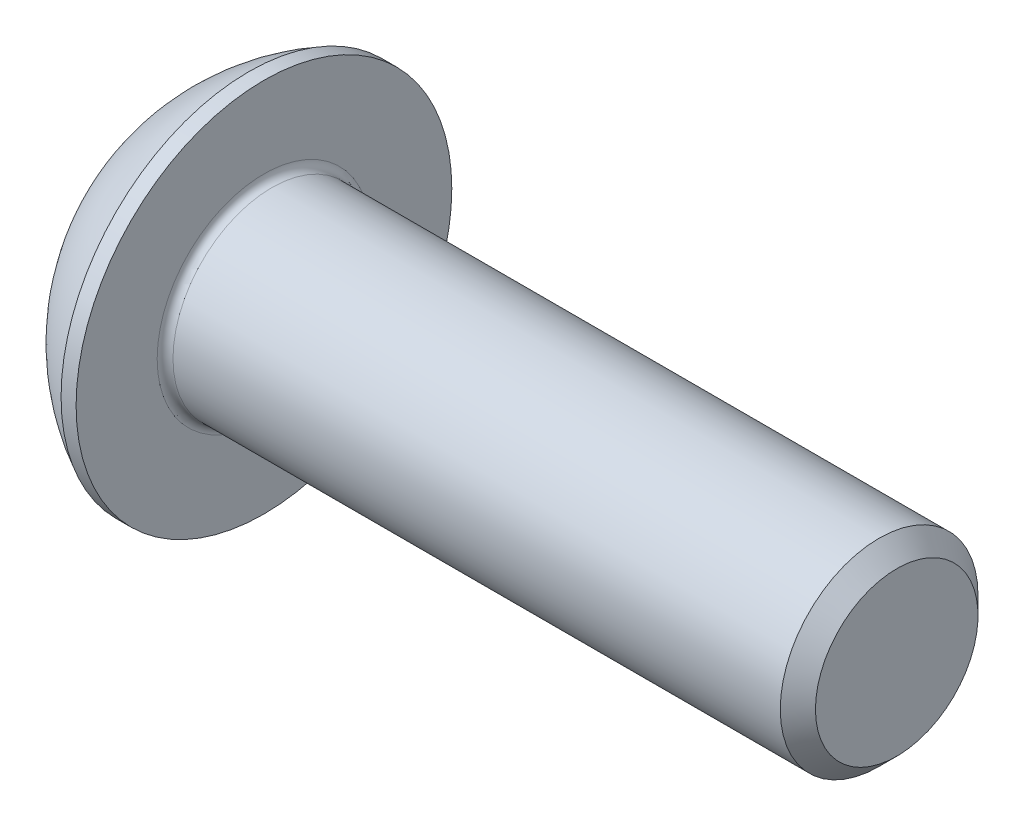
ISO-10303-21;
HEADER;
FILE_DESCRIPTION(('STEP AP214'),'2;1');
FILE_NAME('part.step','',(''),(''),'','','');
FILE_SCHEMA(('AUTOMOTIVE_DESIGN { 1 0 10303 214 1 1 1 1 }'));
ENDSEC;
DATA;
#1=APPLICATION_CONTEXT('core data for automotive mechanical design processes');
#2=APPLICATION_PROTOCOL_DEFINITION('international standard','automotive_design',2000,#1);
#3=PRODUCT_CONTEXT('',#1,'mechanical');
#4=PRODUCT('Part','Part','',(#3));
#5=PRODUCT_RELATED_PRODUCT_CATEGORY('part','',(#4));
#6=PRODUCT_DEFINITION_FORMATION('','',#4);
#7=PRODUCT_DEFINITION_CONTEXT('part definition',#1,'design');
#8=PRODUCT_DEFINITION('design','',#6,#7);
#9=PRODUCT_DEFINITION_SHAPE('','',#8);
#10=(LENGTH_UNIT() NAMED_UNIT(*) SI_UNIT(.MILLI.,.METRE.));
#11=(NAMED_UNIT(*) PLANE_ANGLE_UNIT() SI_UNIT($,.RADIAN.));
#12=(NAMED_UNIT(*) SI_UNIT($,.STERADIAN.) SOLID_ANGLE_UNIT());
#13=UNCERTAINTY_MEASURE_WITH_UNIT(LENGTH_MEASURE(1.E-05),#10,'distance_accuracy_value','');
#14=(GEOMETRIC_REPRESENTATION_CONTEXT(3) GLOBAL_UNCERTAINTY_ASSIGNED_CONTEXT((#13)) GLOBAL_UNIT_ASSIGNED_CONTEXT((#10,
#11,#12)) REPRESENTATION_CONTEXT('',''));
#15=CARTESIAN_POINT('',(0.,0.,0.));
#16=DIRECTION('',(0.,0.,1.));
#17=DIRECTION('',(1.,0.,0.));
#18=AXIS2_PLACEMENT_3D('',#15,#16,#17);
#19=CARTESIAN_POINT('',(0.,0.,0.));
#20=DIRECTION('',(-1.,0.,0.));
#21=DIRECTION('',(0.,0.,1.));
#22=AXIS2_PLACEMENT_3D('',#19,#20,#21);
#23=PLANE('',#22);
#24=CARTESIAN_POINT('',(0.,0.,0.));
#25=DIRECTION('',(-1.,0.,0.));
#26=DIRECTION('',(0.,0.,1.));
#27=AXIS2_PLACEMENT_3D('',#24,#25,#26);
#28=CIRCLE('',#27,2.375);
#29=CARTESIAN_POINT('',(0.,2.375,0.));
#30=VERTEX_POINT('',#29);
#31=EDGE_CURVE('E157',#30,#30,#28,.T.);
#32=ORIENTED_EDGE('',*,*,#31,.T.);
#33=EDGE_LOOP('',(#32));
#34=FACE_BOUND('',#33,.T.);
#35=DIRECTION('',(0.,-1.,0.));
#36=VECTOR('',#35,1.);
#37=CARTESIAN_POINT('',(0.,-0.866025403784438,1.5));
#38=LINE('',#37,#36);
#39=CARTESIAN_POINT('',(0.,0.866025403784439,1.5));
#40=VERTEX_POINT('',#39);
#41=CARTESIAN_POINT('',(0.,-0.866025403784438,1.5));
#42=VERTEX_POINT('',#41);
#43=EDGE_CURVE('E52',#40,#42,#38,.T.);
#44=ORIENTED_EDGE('',*,*,#43,.T.);
#45=DIRECTION('',(0.,-0.500000000000001,-0.866025403784438));
#46=VECTOR('',#45,1.);
#47=CARTESIAN_POINT('',(0.,-1.73205080756888,0.));
#48=LINE('',#47,#46);
#49=CARTESIAN_POINT('',(0.,-1.73205080756888,0.));
#50=VERTEX_POINT('',#49);
#51=EDGE_CURVE('E277',#42,#50,#48,.T.);
#52=ORIENTED_EDGE('',*,*,#51,.T.);
#53=DIRECTION('',(0.,0.500000000000001,-0.866025403784438));
#54=VECTOR('',#53,1.);
#55=CARTESIAN_POINT('',(0.,-0.866025403784438,-1.5));
#56=LINE('',#55,#54);
#57=CARTESIAN_POINT('',(0.,-0.866025403784438,-1.5));
#58=VERTEX_POINT('',#57);
#59=EDGE_CURVE('E132',#50,#58,#56,.T.);
#60=ORIENTED_EDGE('',*,*,#59,.T.);
#61=DIRECTION('',(0.,1.,0.));
#62=VECTOR('',#61,1.);
#63=CARTESIAN_POINT('',(0.,0.866025403784439,-1.5));
#64=LINE('',#63,#62);
#65=CARTESIAN_POINT('',(0.,0.866025403784439,-1.5));
#66=VERTEX_POINT('',#65);
#67=EDGE_CURVE('E280',#58,#66,#64,.T.);
#68=ORIENTED_EDGE('',*,*,#67,.T.);
#69=DIRECTION('',(0.,0.5,0.866025403784439));
#70=VECTOR('',#69,1.);
#71=CARTESIAN_POINT('',(0.,1.73205080756888,0.));
#72=LINE('',#71,#70);
#73=CARTESIAN_POINT('',(0.,1.73205080756888,0.));
#74=VERTEX_POINT('',#73);
#75=EDGE_CURVE('E282',#66,#74,#72,.T.);
#76=ORIENTED_EDGE('',*,*,#75,.T.);
#77=DIRECTION('',(0.,-0.5,0.866025403784439));
#78=VECTOR('',#77,1.);
#79=CARTESIAN_POINT('',(0.,0.866025403784439,1.5));
#80=LINE('',#79,#78);
#81=EDGE_CURVE('E284',#74,#40,#80,.T.);
#82=ORIENTED_EDGE('',*,*,#81,.T.);
#83=EDGE_LOOP('',(#44,#52,#60,#68,#76,#82));
#84=FACE_BOUND('',#83,.T.);
#85=ADVANCED_FACE('F37',(#34,#84),#23,.T.);
#86=CARTESIAN_POINT('',(4.75501582278481,0.,0.));
#87=DIRECTION('',(-1.,0.,0.));
#88=DIRECTION('',(0.,1.,0.));
#89=AXIS2_PLACEMENT_3D('',#86,#87,#88);
#90=SPHERICAL_SURFACE('',#89,5.3151482081814);
#91=CARTESIAN_POINT('',(2.37,0.,0.));
#92=DIRECTION('',(-1.,0.,0.));
#93=DIRECTION('',(0.,0.,1.));
#94=AXIS2_PLACEMENT_3D('',#91,#92,#93);
#95=CIRCLE('',#94,4.75);
#96=CARTESIAN_POINT('',(2.37,4.75,0.));
#97=VERTEX_POINT('',#96);
#98=EDGE_CURVE('E154',#97,#97,#95,.T.);
#99=CARTESIAN_POINT('',(2.37,4.75,0.));
#100=CARTESIAN_POINT('',(2.33822259048669,4.73404434732511,0.));
#101=CARTESIAN_POINT('',(2.30660534291523,4.71776971995817,0.));
#102=CARTESIAN_POINT('',(2.24370380094997,4.68458927158339,0.));
#103=CARTESIAN_POINT('',(2.21241950655618,4.66768345057555,0.));
#104=CARTESIAN_POINT('',(2.15019650024021,4.6332473706621,0.));
#105=CARTESIAN_POINT('',(2.11925778831804,4.6157171117565,0.));
#106=CARTESIAN_POINT('',(2.05773840110808,4.58003923142985,0.));
#107=CARTESIAN_POINT('',(2.02715772582028,4.56189161000879,0.));
#108=CARTESIAN_POINT('',(1.96636673145741,4.52498631044657,0.));
#109=CARTESIAN_POINT('',(1.93615641238234,4.50622863230542,0.));
#110=CARTESIAN_POINT('',(1.87611829826807,4.46811077571318,0.));
#111=CARTESIAN_POINT('',(1.84629050322887,4.4487505972621,0.));
#112=CARTESIAN_POINT('',(1.78702945162455,4.40943553782984,0.));
#113=CARTESIAN_POINT('',(1.75759619505941,4.38948065684866,0.));
#114=CARTESIAN_POINT('',(1.69913607574061,4.34898423002648,0.));
#115=CARTESIAN_POINT('',(1.67010921298694,4.32844268418549,0.));
#116=CARTESIAN_POINT('',(1.61247357298735,4.28678120152175,0.));
#117=CARTESIAN_POINT('',(1.58386479574144,4.265661264699,0.));
#118=CARTESIAN_POINT('',(1.52707685004032,4.22285150694424,0.));
#119=CARTESIAN_POINT('',(1.49889768158512,4.20116168601223,0.));
#120=CARTESIAN_POINT('',(1.44298030371049,4.15722089644741,0.));
#121=CARTESIAN_POINT('',(1.41524209429107,4.13496992781461,0.));
#122=CARTESIAN_POINT('',(1.36021780711889,4.08991580528235,0.));
#123=CARTESIAN_POINT('',(1.33293172936613,4.06711265138288,0.));
#124=CARTESIAN_POINT('',(1.278822696045,4.02096334316478,0.));
#125=CARTESIAN_POINT('',(1.25199974047662,3.99761718884614,0.));
#126=CARTESIAN_POINT('',(1.19882775550162,3.95039128335163,0.));
#127=CARTESIAN_POINT('',(1.172478726095,3.92651153217576,0.));
#128=CARTESIAN_POINT('',(1.1202652065289,3.87822805145535,0.));
#129=CARTESIAN_POINT('',(1.09440071636942,3.85382432191081,0.));
#130=CARTESIAN_POINT('',(1.04316669321618,3.8045027139941,0.));
#131=CARTESIAN_POINT('',(1.01779716022241,3.77958483562192,0.));
#132=CARTESIAN_POINT('',(0.9675632699561,3.72924496668416,0.));
#133=CARTESIAN_POINT('',(0.942698912683562,3.70382297611859,0.));
#134=CARTESIAN_POINT('',(0.893485388936279,3.65248512247887,0.));
#135=CARTESIAN_POINT('',(0.869136222461535,3.62656925940472,0.));
#136=CARTESIAN_POINT('',(0.820962887873489,3.57425409935885,0.));
#137=CARTESIAN_POINT('',(0.797138719760188,3.54785480238711,0.));
#138=CARTESIAN_POINT('',(0.750024977995378,3.49458340787865,0.));
#139=CARTESIAN_POINT('',(0.726735404343869,3.46771131034191,0.));
#140=CARTESIAN_POINT('',(0.68070023227454,3.41350513847464,0.));
#141=CARTESIAN_POINT('',(0.657954633856721,3.3861710641441,0.));
#142=CARTESIAN_POINT('',(0.613016573919582,3.33105194853939,0.));
#143=CARTESIAN_POINT('',(0.590824112400263,3.30326690726522,0.));
#144=CARTESIAN_POINT('',(0.547001265128254,3.24725704926748,0.));
#145=CARTESIAN_POINT('',(0.525370879375564,3.21903223254391,0.));
#146=CARTESIAN_POINT('',(0.482680896105488,3.16215419227902,0.));
#147=CARTESIAN_POINT('',(0.461621298588104,3.13350096873769,0.));
#148=CARTESIAN_POINT('',(0.420081374357153,3.07577765602273,0.));
#149=CARTESIAN_POINT('',(0.399601047643587,3.04670756684908,0.));
#150=CARTESIAN_POINT('',(0.359227914239947,2.98816223197683,0.));
#151=CARTESIAN_POINT('',(0.339335107549873,2.95868698627822,0.));
#152=CARTESIAN_POINT('',(0.300145026860787,2.89934321060632,0.));
#153=CARTESIAN_POINT('',(0.280847752861776,2.86947468063304,0.));
#154=CARTESIAN_POINT('',(0.24285650999714,2.80935636725696,0.));
#155=CARTESIAN_POINT('',(0.224162541131515,2.77910658385417,0.));
#156=CARTESIAN_POINT('',(0.187385439283607,2.71823794734018,0.));
#157=CARTESIAN_POINT('',(0.169302306301324,2.68761909422898,0.));
#158=CARTESIAN_POINT('',(0.133754156035988,2.626024653246,0.));
#159=CARTESIAN_POINT('',(0.116289138752934,2.59504906537422,0.));
#160=CARTESIAN_POINT('',(0.081984269005742,2.53275362391635,0.));
#161=CARTESIAN_POINT('',(0.0651444165416036,2.50143377033028,0.));
#162=CARTESIAN_POINT('',(0.0320966055444289,2.43846244094735,0.));
#163=CARTESIAN_POINT('',(0.0158886470113927,2.40681096515049,0.));
#164=CARTESIAN_POINT('',(0.,2.375,0.));
#165=B_SPLINE_CURVE_WITH_KNOTS('',3,(#99,#100,#101,#102,#103,#104,#105,#106,#107,#108,#109,#110,
#111,#112,#113,#114,#115,#116,#117,#118,#119,#120,#121,#122,#123,#124,#125,#126,#127,#128,#129,
#130,#131,#132,#133,#134,#135,#136,#137,#138,#139,#140,#141,#142,#143,#144,#145,#146,#147,#148,
#149,#150,#151,#152,#153,#154,#155,#156,#157,#158,#159,#160,#161,#162,#163,#164),.UNSPECIFIED.,
.F.,.F.,(4,2,2,2,2,2,2,2,2,2,2,2,2,2,2,2,2,2,2,2,2,2,2,2,2,2,2,2,2,2,2,2,4),(0.,
0.106672849678272,0.213345699356545,0.320018549034817,0.42669139871309,0.533364248391363,
0.640037098069635,0.746709947747908,0.85338279742618,0.960055647104452,1.06672849678273,
1.173401346461,1.28007419613927,1.38674704581754,1.49341989549582,1.60009274517409,
1.70676559485236,1.81343844453063,1.9201112942089,2.02678414388718,2.13345699356545,
2.24012984324372,2.346802692922,2.45347554260027,2.56014839227854,2.66682124195681,
2.77349409163509,2.88016694131336,2.98683979099163,3.0935126406699,3.20018549034817,
3.30685834002645,3.41353118970472),.UNSPECIFIED.);
#166=EDGE_CURVE('BSEAM178',#97,#30,#165,.T.);
#167=ORIENTED_EDGE('',*,*,#98,.T.);
#168=ORIENTED_EDGE('',*,*,#31,.F.);
#169=ORIENTED_EDGE('',*,*,#166,.T.);
#170=ORIENTED_EDGE('',*,*,#166,.F.);
#171=EDGE_LOOP('',(#167,#169,#168,#170));
#172=FACE_BOUND('',#171,.T.);
#173=ADVANCED_FACE('F178',(#172),#90,.T.);
#174=CARTESIAN_POINT('',(0.,0.,0.));
#175=DIRECTION('',(-1.,0.,0.));
#176=DIRECTION('',(0.,0.,1.));
#177=AXIS2_PLACEMENT_3D('',#174,#175,#176);
#178=CYLINDRICAL_SURFACE('',#177,4.75);
#179=ORIENTED_EDGE('',*,*,#98,.F.);
#180=EDGE_LOOP('',(#179));
#181=FACE_BOUND('',#180,.T.);
#182=CARTESIAN_POINT('',(2.75,0.,0.));
#183=DIRECTION('',(-1.,0.,0.));
#184=DIRECTION('',(0.,0.,1.));
#185=AXIS2_PLACEMENT_3D('',#182,#183,#184);
#186=CIRCLE('',#185,4.75);
#187=CARTESIAN_POINT('',(2.75,0.,4.75));
#188=VERTEX_POINT('',#187);
#189=EDGE_CURVE('E151',#188,#188,#186,.T.);
#190=ORIENTED_EDGE('',*,*,#189,.T.);
#191=EDGE_LOOP('',(#190));
#192=FACE_BOUND('',#191,.T.);
#193=ADVANCED_FACE('F183',(#181,#192),#178,.T.);
#194=CARTESIAN_POINT('',(2.75,2.5,0.));
#195=DIRECTION('',(-1.,0.,0.));
#196=DIRECTION('',(0.,0.,1.));
#197=AXIS2_PLACEMENT_3D('',#194,#195,#196);
#198=PLANE('',#197);
#199=CARTESIAN_POINT('',(2.75,0.,0.));
#200=DIRECTION('',(-1.,0.,0.));
#201=DIRECTION('',(0.,0.,1.));
#202=AXIS2_PLACEMENT_3D('',#199,#200,#201);
#203=CIRCLE('',#202,2.7);
#204=CARTESIAN_POINT('',(2.75,0.,2.7));
#205=VERTEX_POINT('',#204);
#206=EDGE_CURVE('E45',#205,#205,#203,.T.);
#207=ORIENTED_EDGE('',*,*,#206,.T.);
#208=EDGE_LOOP('',(#207));
#209=FACE_BOUND('',#208,.T.);
#210=ORIENTED_EDGE('',*,*,#189,.F.);
#211=EDGE_LOOP('',(#210));
#212=FACE_BOUND('',#211,.T.);
#213=ADVANCED_FACE('F162',(#209,#212),#198,.F.);
#214=CARTESIAN_POINT('',(0.,0.,0.));
#215=DIRECTION('',(-1.,0.,0.));
#216=DIRECTION('',(0.,0.,1.));
#217=AXIS2_PLACEMENT_3D('',#214,#215,#216);
#218=CYLINDRICAL_SURFACE('',#217,2.5);
#219=CARTESIAN_POINT('',(2.95,0.,0.));
#220=DIRECTION('',(-1.,0.,0.));
#221=DIRECTION('',(0.,0.,1.));
#222=AXIS2_PLACEMENT_3D('',#219,#220,#221);
#223=CIRCLE('',#222,2.5);
#224=CARTESIAN_POINT('',(2.95,0.,2.5));
#225=VERTEX_POINT('',#224);
#226=EDGE_CURVE('E11',#225,#225,#223,.F.);
#227=ORIENTED_EDGE('',*,*,#226,.T.);
#228=EDGE_LOOP('',(#227));
#229=FACE_BOUND('',#228,.T.);
#230=CARTESIAN_POINT('',(18.305,0.,0.));
#231=DIRECTION('',(-1.,0.,0.));
#232=DIRECTION('',(0.,0.,1.));
#233=AXIS2_PLACEMENT_3D('',#230,#231,#232);
#234=CIRCLE('',#233,2.5);
#235=CARTESIAN_POINT('',(18.305,0.,2.5));
#236=VERTEX_POINT('',#235);
#237=EDGE_CURVE('E148',#236,#236,#234,.T.);
#238=ORIENTED_EDGE('',*,*,#237,.T.);
#239=EDGE_LOOP('',(#238));
#240=FACE_BOUND('',#239,.T.);
#241=ADVANCED_FACE('F192',(#229,#240),#218,.T.);
#242=CARTESIAN_POINT('',(18.75,0.,0.));
#243=DIRECTION('',(-1.,0.,0.));
#244=DIRECTION('',(0.,0.,1.));
#245=AXIS2_PLACEMENT_3D('',#242,#243,#244);
#246=CONICAL_SURFACE('',#245,2.055,0.785398163397441);
#247=ORIENTED_EDGE('',*,*,#237,.F.);
#248=EDGE_LOOP('',(#247));
#249=FACE_BOUND('',#248,.T.);
#250=CARTESIAN_POINT('',(18.75,0.,0.));
#251=DIRECTION('',(-1.,0.,0.));
#252=DIRECTION('',(0.,0.,1.));
#253=AXIS2_PLACEMENT_3D('',#250,#251,#252);
#254=CIRCLE('',#253,2.055);
#255=CARTESIAN_POINT('',(18.75,0.,2.055));
#256=VERTEX_POINT('',#255);
#257=EDGE_CURVE('E144',#256,#256,#254,.T.);
#258=ORIENTED_EDGE('',*,*,#257,.T.);
#259=EDGE_LOOP('',(#258));
#260=FACE_BOUND('',#259,.T.);
#261=ADVANCED_FACE('F173',(#249,#260),#246,.T.);
#262=CARTESIAN_POINT('',(18.75,0.,0.));
#263=DIRECTION('',(-1.,0.,0.));
#264=DIRECTION('',(0.,0.,1.));
#265=AXIS2_PLACEMENT_3D('',#262,#263,#264);
#266=PLANE('',#265);
#267=ORIENTED_EDGE('',*,*,#257,.F.);
#268=EDGE_LOOP('',(#267));
#269=FACE_BOUND('',#268,.T.);
#270=ADVANCED_FACE('F166',(#269),#266,.F.);
#271=CARTESIAN_POINT('',(2.95,0.,0.));
#272=DIRECTION('',(-1.,0.,0.));
#273=DIRECTION('',(0.,0.,1.));
#274=AXIS2_PLACEMENT_3D('',#271,#272,#273);
#275=TOROIDAL_SURFACE('',#274,2.7,0.2);
#276=ORIENTED_EDGE('',*,*,#226,.F.);
#277=EDGE_LOOP('',(#276));
#278=FACE_BOUND('',#277,.T.);
#279=ORIENTED_EDGE('',*,*,#206,.F.);
#280=EDGE_LOOP('',(#279));
#281=FACE_BOUND('',#280,.T.);
#282=ADVANCED_FACE('F39',(#278,#281),#275,.F.);
#283=CARTESIAN_POINT('',(1.56,-1.73205080756888,0.));
#284=DIRECTION('',(0.,0.866025403784438,-0.500000000000001));
#285=DIRECTION('',(0.,0.500000000000001,0.866025403784438));
#286=AXIS2_PLACEMENT_3D('',#283,#284,#285);
#287=PLANE('',#286);
#288=DIRECTION('',(0.,-0.500000000000001,-0.866025403784438));
#289=VECTOR('',#288,1.);
#290=CARTESIAN_POINT('',(1.56,-1.73205080756888,0.));
#291=LINE('',#290,#289);
#292=CARTESIAN_POINT('',(1.56,-0.866025403784438,1.5));
#293=VERTEX_POINT('',#292);
#294=CARTESIAN_POINT('',(1.56,-1.29903810567666,0.750000000000002));
#295=VERTEX_POINT('',#294);
#296=EDGE_CURVE('E118',#293,#295,#291,.T.);
#297=ORIENTED_EDGE('',*,*,#296,.T.);
#298=CARTESIAN_POINT('',(1.56,-1.73205080756888,0.));
#299=VERTEX_POINT('',#298);
#300=EDGE_CURVE('E113',#295,#299,#291,.T.);
#301=ORIENTED_EDGE('',*,*,#300,.T.);
#302=DIRECTION('',(-1.,0.,0.));
#303=VECTOR('',#302,1.);
#304=CARTESIAN_POINT('',(1.56,-1.73205080756888,0.));
#305=LINE('',#304,#303);
#306=EDGE_CURVE('E115',#299,#50,#305,.T.);
#307=ORIENTED_EDGE('',*,*,#306,.T.);
#308=ORIENTED_EDGE('',*,*,#51,.F.);
#309=DIRECTION('',(-1.,0.,0.));
#310=VECTOR('',#309,1.);
#311=CARTESIAN_POINT('',(1.56,-0.866025403784438,1.5));
#312=LINE('',#311,#310);
#313=EDGE_CURVE('E273',#293,#42,#312,.T.);
#314=ORIENTED_EDGE('',*,*,#313,.F.);
#315=EDGE_LOOP('',(#297,#301,#307,#308,#314));
#316=FACE_BOUND('',#315,.T.);
#317=ADVANCED_FACE('F114',(#316),#287,.T.);
#318=CARTESIAN_POINT('',(1.56,-0.866025403784438,-1.5));
#319=DIRECTION('',(0.,0.866025403784438,0.500000000000001));
#320=DIRECTION('',(0.,-0.500000000000001,0.866025403784438));
#321=AXIS2_PLACEMENT_3D('',#318,#319,#320);
#322=PLANE('',#321);
#323=DIRECTION('',(0.,0.500000000000001,-0.866025403784438));
#324=VECTOR('',#323,1.);
#325=CARTESIAN_POINT('',(1.56,-0.866025403784438,-1.5));
#326=LINE('',#325,#324);
#327=CARTESIAN_POINT('',(1.56,-1.29903810567666,-0.750000000000001));
#328=VERTEX_POINT('',#327);
#329=EDGE_CURVE('E60',#299,#328,#326,.T.);
#330=ORIENTED_EDGE('',*,*,#329,.T.);
#331=CARTESIAN_POINT('',(1.56,-0.866025403784438,-1.5));
#332=VERTEX_POINT('',#331);
#333=EDGE_CURVE('E127',#328,#332,#326,.T.);
#334=ORIENTED_EDGE('',*,*,#333,.T.);
#335=DIRECTION('',(-1.,0.,0.));
#336=VECTOR('',#335,1.);
#337=CARTESIAN_POINT('',(1.56,-0.866025403784438,-1.5));
#338=LINE('',#337,#336);
#339=EDGE_CURVE('E134',#332,#58,#338,.T.);
#340=ORIENTED_EDGE('',*,*,#339,.T.);
#341=ORIENTED_EDGE('',*,*,#59,.F.);
#342=ORIENTED_EDGE('',*,*,#306,.F.);
#343=EDGE_LOOP('',(#330,#334,#340,#341,#342));
#344=FACE_BOUND('',#343,.T.);
#345=ADVANCED_FACE('F130',(#344),#322,.T.);
#346=CARTESIAN_POINT('',(1.56,0.866025403784439,-1.5));
#347=DIRECTION('',(0.,0.,1.));
#348=DIRECTION('',(1.,0.,0.));
#349=AXIS2_PLACEMENT_3D('',#346,#347,#348);
#350=PLANE('',#349);
#351=DIRECTION('',(0.,1.,0.));
#352=VECTOR('',#351,1.);
#353=CARTESIAN_POINT('',(1.56,0.866025403784439,-1.5));
#354=LINE('',#353,#352);
#355=CARTESIAN_POINT('',(1.56,0.,-1.5));
#356=VERTEX_POINT('',#355);
#357=EDGE_CURVE('E254',#332,#356,#354,.T.);
#358=ORIENTED_EDGE('',*,*,#357,.T.);
#359=CARTESIAN_POINT('',(1.56,0.866025403784439,-1.5));
#360=VERTEX_POINT('',#359);
#361=EDGE_CURVE('E126',#356,#360,#354,.T.);
#362=ORIENTED_EDGE('',*,*,#361,.T.);
#363=DIRECTION('',(-1.,0.,0.));
#364=VECTOR('',#363,1.);
#365=CARTESIAN_POINT('',(1.56,0.866025403784439,-1.5));
#366=LINE('',#365,#364);
#367=EDGE_CURVE('E139',#360,#66,#366,.T.);
#368=ORIENTED_EDGE('',*,*,#367,.T.);
#369=ORIENTED_EDGE('',*,*,#67,.F.);
#370=ORIENTED_EDGE('',*,*,#339,.F.);
#371=EDGE_LOOP('',(#358,#362,#368,#369,#370));
#372=FACE_BOUND('',#371,.T.);
#373=ADVANCED_FACE('F206',(#372),#350,.T.);
#374=CARTESIAN_POINT('',(1.56,1.73205080756888,0.));
#375=DIRECTION('',(0.,-0.866025403784439,0.5));
#376=DIRECTION('',(0.,-0.5,-0.866025403784439));
#377=AXIS2_PLACEMENT_3D('',#374,#375,#376);
#378=PLANE('',#377);
#379=DIRECTION('',(0.,0.5,0.866025403784439));
#380=VECTOR('',#379,1.);
#381=CARTESIAN_POINT('',(1.56,1.73205080756888,0.));
#382=LINE('',#381,#380);
#383=CARTESIAN_POINT('',(1.56,1.29903810567666,-0.75));
#384=VERTEX_POINT('',#383);
#385=EDGE_CURVE('E243',#360,#384,#382,.T.);
#386=ORIENTED_EDGE('',*,*,#385,.T.);
#387=CARTESIAN_POINT('',(1.56,1.73205080756888,0.));
#388=VERTEX_POINT('',#387);
#389=EDGE_CURVE('E248',#384,#388,#382,.T.);
#390=ORIENTED_EDGE('',*,*,#389,.T.);
#391=DIRECTION('',(-1.,0.,0.));
#392=VECTOR('',#391,1.);
#393=CARTESIAN_POINT('',(1.56,1.73205080756888,0.));
#394=LINE('',#393,#392);
#395=EDGE_CURVE('E288',#388,#74,#394,.T.);
#396=ORIENTED_EDGE('',*,*,#395,.T.);
#397=ORIENTED_EDGE('',*,*,#75,.F.);
#398=ORIENTED_EDGE('',*,*,#367,.F.);
#399=EDGE_LOOP('',(#386,#390,#396,#397,#398));
#400=FACE_BOUND('',#399,.T.);
#401=ADVANCED_FACE('F209',(#400),#378,.T.);
#402=CARTESIAN_POINT('',(1.56,0.866025403784439,1.5));
#403=DIRECTION('',(0.,-0.866025403784439,-0.5));
#404=DIRECTION('',(0.,0.5,-0.866025403784439));
#405=AXIS2_PLACEMENT_3D('',#402,#403,#404);
#406=PLANE('',#405);
#407=DIRECTION('',(0.,-0.5,0.866025403784439));
#408=VECTOR('',#407,1.);
#409=CARTESIAN_POINT('',(1.56,0.866025403784439,1.5));
#410=LINE('',#409,#408);
#411=CARTESIAN_POINT('',(1.56,1.29903810567666,0.75));
#412=VERTEX_POINT('',#411);
#413=EDGE_CURVE('E251',#388,#412,#410,.T.);
#414=ORIENTED_EDGE('',*,*,#413,.T.);
#415=CARTESIAN_POINT('',(1.56,0.866025403784439,1.5));
#416=VERTEX_POINT('',#415);
#417=EDGE_CURVE('E259',#412,#416,#410,.T.);
#418=ORIENTED_EDGE('',*,*,#417,.T.);
#419=DIRECTION('',(-1.,0.,0.));
#420=VECTOR('',#419,1.);
#421=CARTESIAN_POINT('',(1.56,0.866025403784439,1.5));
#422=LINE('',#421,#420);
#423=EDGE_CURVE('E272',#416,#40,#422,.T.);
#424=ORIENTED_EDGE('',*,*,#423,.T.);
#425=ORIENTED_EDGE('',*,*,#81,.F.);
#426=ORIENTED_EDGE('',*,*,#395,.F.);
#427=EDGE_LOOP('',(#414,#418,#424,#425,#426));
#428=FACE_BOUND('',#427,.T.);
#429=ADVANCED_FACE('F213',(#428),#406,.T.);
#430=CARTESIAN_POINT('',(1.56,-0.866025403784438,1.5));
#431=DIRECTION('',(0.,0.,-1.));
#432=DIRECTION('',(-1.,0.,0.));
#433=AXIS2_PLACEMENT_3D('',#430,#431,#432);
#434=PLANE('',#433);
#435=DIRECTION('',(0.,-1.,0.));
#436=VECTOR('',#435,1.);
#437=CARTESIAN_POINT('',(1.56,-0.866025403784438,1.5));
#438=LINE('',#437,#436);
#439=CARTESIAN_POINT('',(1.56,0.,1.5));
#440=VERTEX_POINT('',#439);
#441=EDGE_CURVE('E265',#416,#440,#438,.T.);
#442=ORIENTED_EDGE('',*,*,#441,.T.);
#443=EDGE_CURVE('E267',#440,#293,#438,.T.);
#444=ORIENTED_EDGE('',*,*,#443,.T.);
#445=ORIENTED_EDGE('',*,*,#313,.T.);
#446=ORIENTED_EDGE('',*,*,#43,.F.);
#447=ORIENTED_EDGE('',*,*,#423,.F.);
#448=EDGE_LOOP('',(#442,#444,#445,#446,#447));
#449=FACE_BOUND('',#448,.T.);
#450=ADVANCED_FACE('F217',(#449),#434,.T.);
#451=CARTESIAN_POINT('',(1.56,-1.73205080756888,0.));
#452=DIRECTION('',(1.,0.,0.));
#453=DIRECTION('',(0.,0.,-1.));
#454=AXIS2_PLACEMENT_3D('',#451,#452,#453);
#455=PLANE('',#454);
#456=CARTESIAN_POINT('',(1.56,0.,0.));
#457=DIRECTION('',(-1.,0.,0.));
#458=DIRECTION('',(0.,0.,1.));
#459=AXIS2_PLACEMENT_3D('',#456,#457,#458);
#460=CIRCLE('',#459,1.5);
#461=EDGE_CURVE('E240',#384,#356,#460,.T.);
#462=ORIENTED_EDGE('',*,*,#461,.F.);
#463=ORIENTED_EDGE('',*,*,#385,.F.);
#464=ORIENTED_EDGE('',*,*,#361,.F.);
#465=EDGE_LOOP('',(#462,#463,#464));
#466=FACE_BOUND('',#465,.T.);
#467=ADVANCED_FACE('F221',(#466),#455,.F.);
#468=EDGE_CURVE('E145',#412,#384,#460,.T.);
#469=ORIENTED_EDGE('',*,*,#468,.F.);
#470=ORIENTED_EDGE('',*,*,#413,.F.);
#471=ORIENTED_EDGE('',*,*,#389,.F.);
#472=EDGE_LOOP('',(#469,#470,#471));
#473=FACE_BOUND('',#472,.T.);
#474=ADVANCED_FACE('F230',(#473),#455,.F.);
#475=EDGE_CURVE('E138',#440,#412,#460,.T.);
#476=ORIENTED_EDGE('',*,*,#475,.F.);
#477=ORIENTED_EDGE('',*,*,#441,.F.);
#478=ORIENTED_EDGE('',*,*,#417,.F.);
#479=EDGE_LOOP('',(#476,#477,#478));
#480=FACE_BOUND('',#479,.T.);
#481=ADVANCED_FACE('F235',(#480),#455,.F.);
#482=EDGE_CURVE('E133',#295,#440,#460,.T.);
#483=ORIENTED_EDGE('',*,*,#482,.F.);
#484=ORIENTED_EDGE('',*,*,#296,.F.);
#485=ORIENTED_EDGE('',*,*,#443,.F.);
#486=EDGE_LOOP('',(#483,#484,#485));
#487=FACE_BOUND('',#486,.T.);
#488=ADVANCED_FACE('F228',(#487),#455,.F.);
#489=EDGE_CURVE('E124',#328,#295,#460,.T.);
#490=ORIENTED_EDGE('',*,*,#489,.F.);
#491=ORIENTED_EDGE('',*,*,#329,.F.);
#492=ORIENTED_EDGE('',*,*,#300,.F.);
#493=EDGE_LOOP('',(#490,#491,#492));
#494=FACE_BOUND('',#493,.T.);
#495=ADVANCED_FACE('F123',(#494),#455,.F.);
#496=EDGE_CURVE('E246',#356,#328,#460,.T.);
#497=ORIENTED_EDGE('',*,*,#496,.F.);
#498=ORIENTED_EDGE('',*,*,#357,.F.);
#499=ORIENTED_EDGE('',*,*,#333,.F.);
#500=EDGE_LOOP('',(#497,#498,#499));
#501=FACE_BOUND('',#500,.T.);
#502=ADVANCED_FACE('F201',(#501),#455,.F.);
#503=CARTESIAN_POINT('',(2.42602540378445,0.,0.));
#504=DIRECTION('',(-1.,0.,0.));
#505=DIRECTION('',(0.,0.,1.));
#506=AXIS2_PLACEMENT_3D('',#503,#504,#505);
#507=CONICAL_SURFACE('',#506,0.,1.04719755119659);
#508=ORIENTED_EDGE('',*,*,#475,.T.);
#509=ORIENTED_EDGE('',*,*,#468,.T.);
#510=ORIENTED_EDGE('',*,*,#461,.T.);
#511=ORIENTED_EDGE('',*,*,#496,.T.);
#512=ORIENTED_EDGE('',*,*,#489,.T.);
#513=ORIENTED_EDGE('',*,*,#482,.T.);
#514=EDGE_LOOP('',(#508,#509,#510,#511,#512,#513));
#515=FACE_BOUND('',#514,.T.);
#516=CARTESIAN_POINT('',(2.42602540378445,0.,0.));
#517=VERTEX_POINT('',#516);
#518=VERTEX_LOOP('',#517);
#519=FACE_BOUND('',#518,.T.);
#520=ADVANCED_FACE('F199',(#515,#519),#507,.F.);
#521=CLOSED_SHELL('',(#85,#173,#193,#213,#241,#261,#270,#282,#317,#345,#373,#401,#429,#450,#467,
#474,#481,#488,#495,#502,#520));
#522=MANIFOLD_SOLID_BREP('B2',#521);
#523=ADVANCED_BREP_SHAPE_REPRESENTATION('',(#18,#522),#14);
#524=SHAPE_DEFINITION_REPRESENTATION(#9,#523);
ENDSEC;
END-ISO-10303-21;
